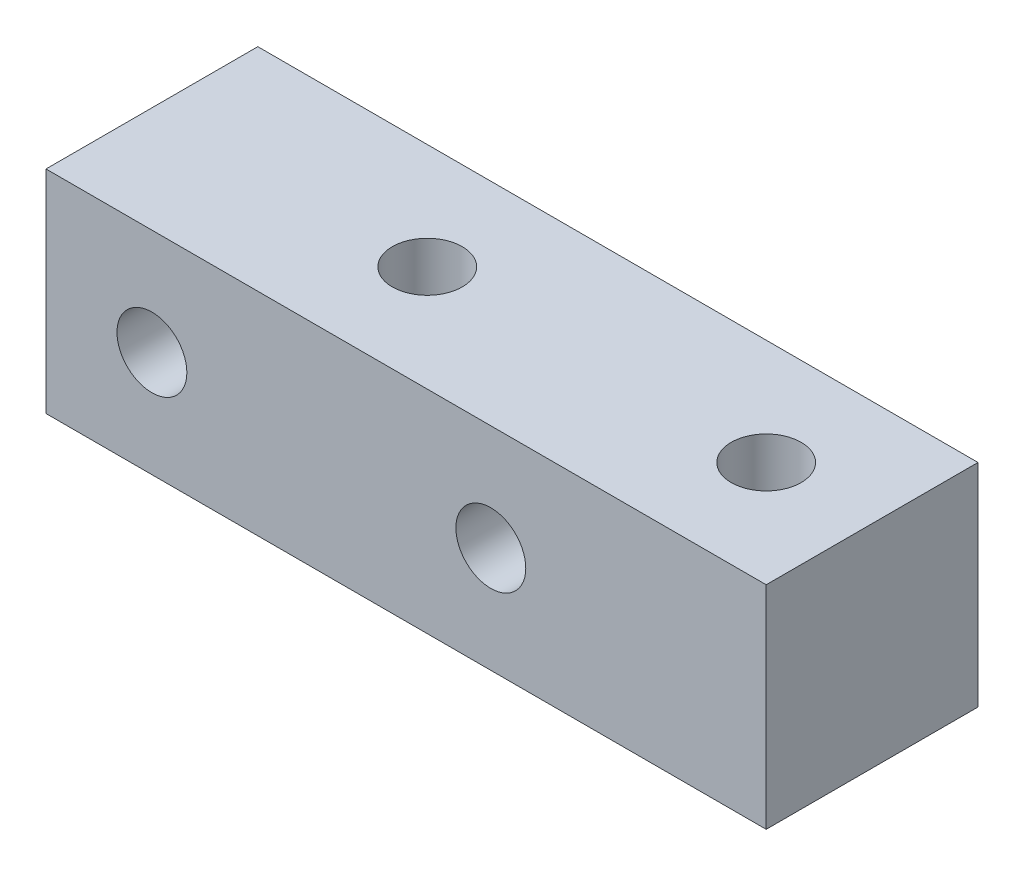
ISO-10303-21;
HEADER;
FILE_DESCRIPTION(('STEP AP214'),'2;1');
FILE_NAME('part.step','',(''),(''),'','','');
FILE_SCHEMA(('AUTOMOTIVE_DESIGN { 1 0 10303 214 1 1 1 1 }'));
ENDSEC;
DATA;
#1=APPLICATION_CONTEXT('core data for automotive mechanical design processes');
#2=APPLICATION_PROTOCOL_DEFINITION('international standard','automotive_design',2000,#1);
#3=PRODUCT_CONTEXT('',#1,'mechanical');
#4=PRODUCT('Part','Part','',(#3));
#5=PRODUCT_RELATED_PRODUCT_CATEGORY('part','',(#4));
#6=PRODUCT_DEFINITION_FORMATION('','',#4);
#7=PRODUCT_DEFINITION_CONTEXT('part definition',#1,'design');
#8=PRODUCT_DEFINITION('design','',#6,#7);
#9=PRODUCT_DEFINITION_SHAPE('','',#8);
#10=(LENGTH_UNIT() NAMED_UNIT(*) SI_UNIT(.MILLI.,.METRE.));
#11=(NAMED_UNIT(*) PLANE_ANGLE_UNIT() SI_UNIT($,.RADIAN.));
#12=(NAMED_UNIT(*) SI_UNIT($,.STERADIAN.) SOLID_ANGLE_UNIT());
#13=UNCERTAINTY_MEASURE_WITH_UNIT(LENGTH_MEASURE(1.E-05),#10,'distance_accuracy_value','');
#14=(GEOMETRIC_REPRESENTATION_CONTEXT(3) GLOBAL_UNCERTAINTY_ASSIGNED_CONTEXT((#13)) GLOBAL_UNIT_ASSIGNED_CONTEXT((#10,
#11,#12)) REPRESENTATION_CONTEXT('',''));
#15=CARTESIAN_POINT('',(0.,0.,0.));
#16=DIRECTION('',(0.,0.,1.));
#17=DIRECTION('',(1.,0.,0.));
#18=AXIS2_PLACEMENT_3D('',#15,#16,#17);
#19=CARTESIAN_POINT('',(17.,10.,-5.));
#20=DIRECTION('',(-1.,0.,0.));
#21=DIRECTION('',(0.,0.,1.));
#22=AXIS2_PLACEMENT_3D('',#19,#20,#21);
#23=PLANE('',#22);
#24=DIRECTION('',(0.,0.,-1.));
#25=VECTOR('',#24,1.);
#26=CARTESIAN_POINT('',(17.,0.,-5.));
#27=LINE('',#26,#25);
#28=CARTESIAN_POINT('',(17.,0.,5.));
#29=VERTEX_POINT('',#28);
#30=CARTESIAN_POINT('',(17.,0.,-5.));
#31=VERTEX_POINT('',#30);
#32=EDGE_CURVE('E106',#29,#31,#27,.T.);
#33=ORIENTED_EDGE('',*,*,#32,.T.);
#34=DIRECTION('',(0.,-1.,0.));
#35=VECTOR('',#34,1.);
#36=CARTESIAN_POINT('',(17.,10.,-5.));
#37=LINE('',#36,#35);
#38=CARTESIAN_POINT('',(17.,10.,-5.));
#39=VERTEX_POINT('',#38);
#40=EDGE_CURVE('E11',#39,#31,#37,.T.);
#41=ORIENTED_EDGE('',*,*,#40,.F.);
#42=DIRECTION('',(0.,0.,-1.));
#43=VECTOR('',#42,1.);
#44=CARTESIAN_POINT('',(17.,10.,-5.));
#45=LINE('',#44,#43);
#46=CARTESIAN_POINT('',(17.,10.,5.));
#47=VERTEX_POINT('',#46);
#48=EDGE_CURVE('E94',#47,#39,#45,.T.);
#49=ORIENTED_EDGE('',*,*,#48,.F.);
#50=DIRECTION('',(0.,-1.,0.));
#51=VECTOR('',#50,1.);
#52=CARTESIAN_POINT('',(17.,10.,5.));
#53=LINE('',#52,#51);
#54=EDGE_CURVE('E105',#47,#29,#53,.T.);
#55=ORIENTED_EDGE('',*,*,#54,.T.);
#56=EDGE_LOOP('',(#33,#41,#49,#55));
#57=FACE_BOUND('',#56,.T.);
#58=ADVANCED_FACE('F43',(#57),#23,.F.);
#59=CARTESIAN_POINT('',(-17.,10.,-5.));
#60=DIRECTION('',(0.,0.,1.));
#61=DIRECTION('',(1.,0.,0.));
#62=AXIS2_PLACEMENT_3D('',#59,#60,#61);
#63=PLANE('',#62);
#64=CARTESIAN_POINT('',(-12.,5.,-5.));
#65=DIRECTION('',(0.,0.,1.));
#66=DIRECTION('',(1.,0.,0.));
#67=AXIS2_PLACEMENT_3D('',#64,#65,#66);
#68=CIRCLE('',#67,1.65);
#69=CARTESIAN_POINT('',(-10.35,5.,-5.));
#70=VERTEX_POINT('',#69);
#71=EDGE_CURVE('E123',#70,#70,#68,.T.);
#72=ORIENTED_EDGE('',*,*,#71,.T.);
#73=EDGE_LOOP('',(#72));
#74=FACE_BOUND('',#73,.T.);
#75=CARTESIAN_POINT('',(4.,5.,-5.));
#76=DIRECTION('',(0.,0.,1.));
#77=DIRECTION('',(1.,0.,0.));
#78=AXIS2_PLACEMENT_3D('',#75,#76,#77);
#79=CIRCLE('',#78,1.65);
#80=CARTESIAN_POINT('',(5.65,5.,-5.));
#81=VERTEX_POINT('',#80);
#82=EDGE_CURVE('E108',#81,#81,#79,.T.);
#83=ORIENTED_EDGE('',*,*,#82,.T.);
#84=EDGE_LOOP('',(#83));
#85=FACE_BOUND('',#84,.T.);
#86=DIRECTION('',(-1.,0.,0.));
#87=VECTOR('',#86,1.);
#88=CARTESIAN_POINT('',(-17.,0.,-5.));
#89=LINE('',#88,#87);
#90=CARTESIAN_POINT('',(-17.,0.,-5.));
#91=VERTEX_POINT('',#90);
#92=EDGE_CURVE('E98',#31,#91,#89,.T.);
#93=ORIENTED_EDGE('',*,*,#92,.T.);
#94=DIRECTION('',(0.,-1.,0.));
#95=VECTOR('',#94,1.);
#96=CARTESIAN_POINT('',(-17.,10.,-5.));
#97=LINE('',#96,#95);
#98=CARTESIAN_POINT('',(-17.,10.,-5.));
#99=VERTEX_POINT('',#98);
#100=EDGE_CURVE('E51',#99,#91,#97,.T.);
#101=ORIENTED_EDGE('',*,*,#100,.F.);
#102=DIRECTION('',(-1.,0.,0.));
#103=VECTOR('',#102,1.);
#104=CARTESIAN_POINT('',(-17.,10.,-5.));
#105=LINE('',#104,#103);
#106=EDGE_CURVE('E90',#39,#99,#105,.T.);
#107=ORIENTED_EDGE('',*,*,#106,.F.);
#108=ORIENTED_EDGE('',*,*,#40,.T.);
#109=EDGE_LOOP('',(#93,#101,#107,#108));
#110=FACE_BOUND('',#109,.T.);
#111=ADVANCED_FACE('F100',(#74,#85,#110),#63,.F.);
#112=CARTESIAN_POINT('',(-17.,10.,-5.));
#113=DIRECTION('',(1.,0.,0.));
#114=DIRECTION('',(0.,0.,-1.));
#115=AXIS2_PLACEMENT_3D('',#112,#113,#114);
#116=PLANE('',#115);
#117=DIRECTION('',(0.,0.,1.));
#118=VECTOR('',#117,1.);
#119=CARTESIAN_POINT('',(-17.,0.,-5.));
#120=LINE('',#119,#118);
#121=CARTESIAN_POINT('',(-17.,0.,5.));
#122=VERTEX_POINT('',#121);
#123=EDGE_CURVE('E78',#91,#122,#120,.T.);
#124=ORIENTED_EDGE('',*,*,#123,.T.);
#125=DIRECTION('',(0.,-1.,0.));
#126=VECTOR('',#125,1.);
#127=CARTESIAN_POINT('',(-17.,10.,5.));
#128=LINE('',#127,#126);
#129=CARTESIAN_POINT('',(-17.,10.,5.));
#130=VERTEX_POINT('',#129);
#131=EDGE_CURVE('E97',#130,#122,#128,.T.);
#132=ORIENTED_EDGE('',*,*,#131,.F.);
#133=DIRECTION('',(0.,0.,1.));
#134=VECTOR('',#133,1.);
#135=CARTESIAN_POINT('',(-17.,10.,-5.));
#136=LINE('',#135,#134);
#137=EDGE_CURVE('E95',#99,#130,#136,.T.);
#138=ORIENTED_EDGE('',*,*,#137,.F.);
#139=ORIENTED_EDGE('',*,*,#100,.T.);
#140=EDGE_LOOP('',(#124,#132,#138,#139));
#141=FACE_BOUND('',#140,.T.);
#142=ADVANCED_FACE('F99',(#141),#116,.F.);
#143=CARTESIAN_POINT('',(-17.,10.,5.));
#144=DIRECTION('',(0.,0.,-1.));
#145=DIRECTION('',(-1.,0.,0.));
#146=AXIS2_PLACEMENT_3D('',#143,#144,#145);
#147=PLANE('',#146);
#148=CARTESIAN_POINT('',(-12.,5.,5.));
#149=DIRECTION('',(0.,0.,1.));
#150=DIRECTION('',(1.,0.,0.));
#151=AXIS2_PLACEMENT_3D('',#148,#149,#150);
#152=CIRCLE('',#151,1.65);
#153=CARTESIAN_POINT('',(-10.35,5.,5.));
#154=VERTEX_POINT('',#153);
#155=EDGE_CURVE('E126',#154,#154,#152,.T.);
#156=ORIENTED_EDGE('',*,*,#155,.F.);
#157=EDGE_LOOP('',(#156));
#158=FACE_BOUND('',#157,.T.);
#159=CARTESIAN_POINT('',(4.,5.,5.));
#160=DIRECTION('',(0.,0.,1.));
#161=DIRECTION('',(1.,0.,0.));
#162=AXIS2_PLACEMENT_3D('',#159,#160,#161);
#163=CIRCLE('',#162,1.65);
#164=CARTESIAN_POINT('',(5.65,5.,5.));
#165=VERTEX_POINT('',#164);
#166=EDGE_CURVE('E124',#165,#165,#163,.T.);
#167=ORIENTED_EDGE('',*,*,#166,.F.);
#168=EDGE_LOOP('',(#167));
#169=FACE_BOUND('',#168,.T.);
#170=DIRECTION('',(1.,0.,0.));
#171=VECTOR('',#170,1.);
#172=CARTESIAN_POINT('',(-17.,0.,5.));
#173=LINE('',#172,#171);
#174=EDGE_CURVE('E85',#122,#29,#173,.T.);
#175=ORIENTED_EDGE('',*,*,#174,.T.);
#176=ORIENTED_EDGE('',*,*,#54,.F.);
#177=DIRECTION('',(1.,0.,0.));
#178=VECTOR('',#177,1.);
#179=CARTESIAN_POINT('',(-17.,10.,5.));
#180=LINE('',#179,#178);
#181=EDGE_CURVE('E56',#130,#47,#180,.T.);
#182=ORIENTED_EDGE('',*,*,#181,.F.);
#183=ORIENTED_EDGE('',*,*,#131,.T.);
#184=EDGE_LOOP('',(#175,#176,#182,#183));
#185=FACE_BOUND('',#184,.T.);
#186=ADVANCED_FACE('F111',(#158,#169,#185),#147,.F.);
#187=CARTESIAN_POINT('',(0.,10.,0.));
#188=DIRECTION('',(0.,1.,0.));
#189=DIRECTION('',(0.,0.,1.));
#190=AXIS2_PLACEMENT_3D('',#187,#188,#189);
#191=PLANE('',#190);
#192=CARTESIAN_POINT('',(12.,10.,0.));
#193=DIRECTION('',(0.,1.,0.));
#194=DIRECTION('',(0.,0.,1.));
#195=AXIS2_PLACEMENT_3D('',#192,#193,#194);
#196=CIRCLE('',#195,1.64999999999999);
#197=CARTESIAN_POINT('',(12.,10.,1.64999999999999));
#198=VERTEX_POINT('',#197);
#199=EDGE_CURVE('E139',#198,#198,#196,.T.);
#200=ORIENTED_EDGE('',*,*,#199,.F.);
#201=EDGE_LOOP('',(#200));
#202=FACE_BOUND('',#201,.T.);
#203=CARTESIAN_POINT('',(-4.,10.,0.));
#204=DIRECTION('',(0.,1.,0.));
#205=DIRECTION('',(0.,0.,1.));
#206=AXIS2_PLACEMENT_3D('',#203,#204,#205);
#207=CIRCLE('',#206,1.64999999999999);
#208=CARTESIAN_POINT('',(-4.,10.,1.64999999999999));
#209=VERTEX_POINT('',#208);
#210=EDGE_CURVE('E132',#209,#209,#207,.T.);
#211=ORIENTED_EDGE('',*,*,#210,.F.);
#212=EDGE_LOOP('',(#211));
#213=FACE_BOUND('',#212,.T.);
#214=ORIENTED_EDGE('',*,*,#48,.T.);
#215=ORIENTED_EDGE('',*,*,#106,.T.);
#216=ORIENTED_EDGE('',*,*,#137,.T.);
#217=ORIENTED_EDGE('',*,*,#181,.T.);
#218=EDGE_LOOP('',(#214,#215,#216,#217));
#219=FACE_BOUND('',#218,.T.);
#220=ADVANCED_FACE('F89',(#202,#213,#219),#191,.T.);
#221=CARTESIAN_POINT('',(0.,0.,0.));
#222=DIRECTION('',(0.,1.,0.));
#223=DIRECTION('',(0.,0.,1.));
#224=AXIS2_PLACEMENT_3D('',#221,#222,#223);
#225=PLANE('',#224);
#226=CARTESIAN_POINT('',(12.,0.,0.));
#227=DIRECTION('',(0.,1.,0.));
#228=DIRECTION('',(0.,0.,1.));
#229=AXIS2_PLACEMENT_3D('',#226,#227,#228);
#230=CIRCLE('',#229,1.64999999999999);
#231=CARTESIAN_POINT('',(12.,0.,1.64999999999999));
#232=VERTEX_POINT('',#231);
#233=EDGE_CURVE('E140',#232,#232,#230,.T.);
#234=ORIENTED_EDGE('',*,*,#233,.T.);
#235=EDGE_LOOP('',(#234));
#236=FACE_BOUND('',#235,.T.);
#237=CARTESIAN_POINT('',(-4.,0.,0.));
#238=DIRECTION('',(0.,1.,0.));
#239=DIRECTION('',(0.,0.,1.));
#240=AXIS2_PLACEMENT_3D('',#237,#238,#239);
#241=CIRCLE('',#240,1.64999999999999);
#242=CARTESIAN_POINT('',(-4.,0.,1.64999999999999));
#243=VERTEX_POINT('',#242);
#244=EDGE_CURVE('E133',#243,#243,#241,.T.);
#245=ORIENTED_EDGE('',*,*,#244,.T.);
#246=EDGE_LOOP('',(#245));
#247=FACE_BOUND('',#246,.T.);
#248=ORIENTED_EDGE('',*,*,#32,.F.);
#249=ORIENTED_EDGE('',*,*,#174,.F.);
#250=ORIENTED_EDGE('',*,*,#123,.F.);
#251=ORIENTED_EDGE('',*,*,#92,.F.);
#252=EDGE_LOOP('',(#248,#249,#250,#251));
#253=FACE_BOUND('',#252,.T.);
#254=ADVANCED_FACE('F120',(#236,#247,#253),#225,.F.);
#255=CARTESIAN_POINT('',(4.,5.,5.));
#256=DIRECTION('',(0.,0.,1.));
#257=DIRECTION('',(1.,0.,0.));
#258=AXIS2_PLACEMENT_3D('',#255,#256,#257);
#259=CYLINDRICAL_SURFACE('',#258,1.65);
#260=ORIENTED_EDGE('',*,*,#82,.F.);
#261=EDGE_LOOP('',(#260));
#262=FACE_BOUND('',#261,.T.);
#263=ORIENTED_EDGE('',*,*,#166,.T.);
#264=EDGE_LOOP('',(#263));
#265=FACE_BOUND('',#264,.T.);
#266=ADVANCED_FACE('F162',(#262,#265),#259,.F.);
#267=CARTESIAN_POINT('',(-12.,5.,5.));
#268=DIRECTION('',(0.,0.,1.));
#269=DIRECTION('',(1.,0.,0.));
#270=AXIS2_PLACEMENT_3D('',#267,#268,#269);
#271=CYLINDRICAL_SURFACE('',#270,1.65);
#272=ORIENTED_EDGE('',*,*,#71,.F.);
#273=EDGE_LOOP('',(#272));
#274=FACE_BOUND('',#273,.T.);
#275=ORIENTED_EDGE('',*,*,#155,.T.);
#276=EDGE_LOOP('',(#275));
#277=FACE_BOUND('',#276,.T.);
#278=ADVANCED_FACE('F153',(#274,#277),#271,.F.);
#279=CARTESIAN_POINT('',(-4.,10.,0.));
#280=DIRECTION('',(0.,1.,0.));
#281=DIRECTION('',(0.,0.,1.));
#282=AXIS2_PLACEMENT_3D('',#279,#280,#281);
#283=CYLINDRICAL_SURFACE('',#282,1.64999999999999);
#284=ORIENTED_EDGE('',*,*,#244,.F.);
#285=EDGE_LOOP('',(#284));
#286=FACE_BOUND('',#285,.T.);
#287=ORIENTED_EDGE('',*,*,#210,.T.);
#288=EDGE_LOOP('',(#287));
#289=FACE_BOUND('',#288,.T.);
#290=ADVANCED_FACE('F151',(#286,#289),#283,.F.);
#291=CARTESIAN_POINT('',(12.,10.,0.));
#292=DIRECTION('',(0.,1.,0.));
#293=DIRECTION('',(0.,0.,1.));
#294=AXIS2_PLACEMENT_3D('',#291,#292,#293);
#295=CYLINDRICAL_SURFACE('',#294,1.64999999999999);
#296=ORIENTED_EDGE('',*,*,#233,.F.);
#297=EDGE_LOOP('',(#296));
#298=FACE_BOUND('',#297,.T.);
#299=ORIENTED_EDGE('',*,*,#199,.T.);
#300=EDGE_LOOP('',(#299));
#301=FACE_BOUND('',#300,.T.);
#302=ADVANCED_FACE('F145',(#298,#301),#295,.F.);
#303=CLOSED_SHELL('',(#58,#111,#142,#186,#220,#254,#266,#278,#290,#302));
#304=MANIFOLD_SOLID_BREP('B2',#303);
#305=ADVANCED_BREP_SHAPE_REPRESENTATION('',(#18,#304),#14);
#306=SHAPE_DEFINITION_REPRESENTATION(#9,#305);
ENDSEC;
END-ISO-10303-21;
